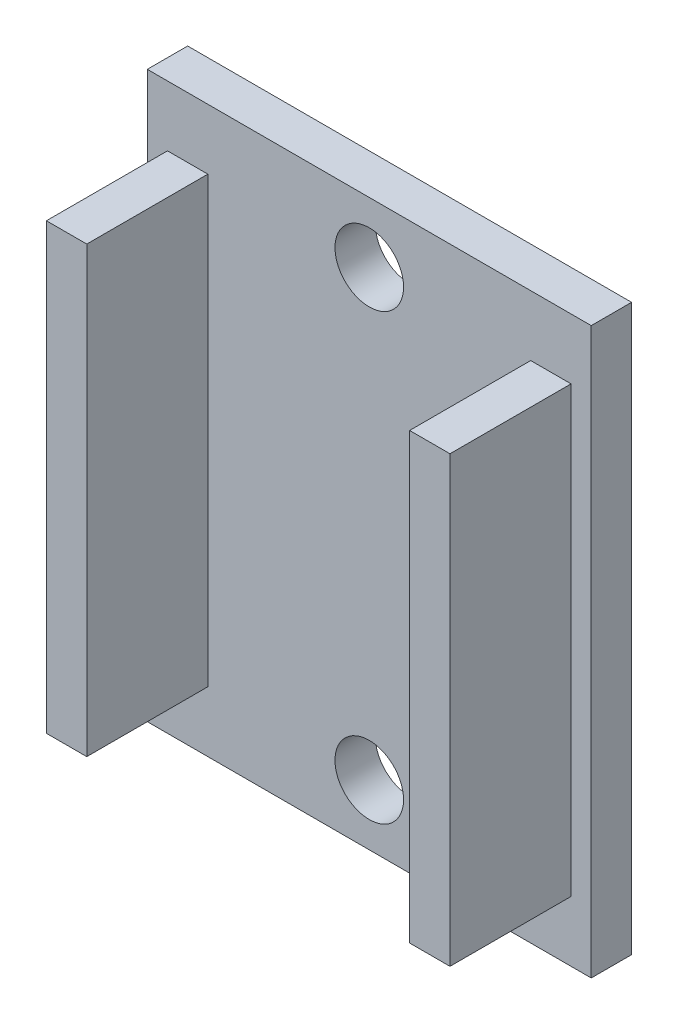
ISO-10303-21;
HEADER;
FILE_DESCRIPTION(('STEP AP214'),'2;1');
FILE_NAME('part.step','',(''),(''),'','','');
FILE_SCHEMA(('AUTOMOTIVE_DESIGN { 1 0 10303 214 1 1 1 1 }'));
ENDSEC;
DATA;
#1=APPLICATION_CONTEXT('core data for automotive mechanical design processes');
#2=APPLICATION_PROTOCOL_DEFINITION('international standard','automotive_design',2000,#1);
#3=PRODUCT_CONTEXT('',#1,'mechanical');
#4=PRODUCT('Part','Part','',(#3));
#5=PRODUCT_RELATED_PRODUCT_CATEGORY('part','',(#4));
#6=PRODUCT_DEFINITION_FORMATION('','',#4);
#7=PRODUCT_DEFINITION_CONTEXT('part definition',#1,'design');
#8=PRODUCT_DEFINITION('design','',#6,#7);
#9=PRODUCT_DEFINITION_SHAPE('','',#8);
#10=(LENGTH_UNIT() NAMED_UNIT(*) SI_UNIT(.MILLI.,.METRE.));
#11=(NAMED_UNIT(*) PLANE_ANGLE_UNIT() SI_UNIT($,.RADIAN.));
#12=(NAMED_UNIT(*) SI_UNIT($,.STERADIAN.) SOLID_ANGLE_UNIT());
#13=UNCERTAINTY_MEASURE_WITH_UNIT(LENGTH_MEASURE(1.E-05),#10,'distance_accuracy_value','');
#14=(GEOMETRIC_REPRESENTATION_CONTEXT(3) GLOBAL_UNCERTAINTY_ASSIGNED_CONTEXT((#13)) GLOBAL_UNIT_ASSIGNED_CONTEXT((#10,
#11,#12)) REPRESENTATION_CONTEXT('',''));
#15=CARTESIAN_POINT('',(0.,0.,0.));
#16=DIRECTION('',(0.,0.,1.));
#17=DIRECTION('',(1.,0.,0.));
#18=AXIS2_PLACEMENT_3D('',#15,#16,#17);
#19=CARTESIAN_POINT('',(0.,0.,90.));
#20=DIRECTION('',(0.,0.,1.));
#21=DIRECTION('',(1.,0.,0.));
#22=AXIS2_PLACEMENT_3D('',#19,#20,#21);
#23=PLANE('',#22);
#24=DIRECTION('',(0.,-1.,0.));
#25=VECTOR('',#24,1.);
#26=CARTESIAN_POINT('',(-195.,40.,90.));
#27=LINE('',#26,#25);
#28=CARTESIAN_POINT('',(-195.,40.,90.));
#29=VERTEX_POINT('',#28);
#30=CARTESIAN_POINT('',(-195.,18.,90.));
#31=VERTEX_POINT('',#30);
#32=EDGE_CURVE('E57',#29,#31,#27,.T.);
#33=ORIENTED_EDGE('',*,*,#32,.F.);
#34=DIRECTION('',(-1.,0.,0.));
#35=VECTOR('',#34,1.);
#36=CARTESIAN_POINT('',(-195.,40.,90.));
#37=LINE('',#36,#35);
#38=CARTESIAN_POINT('',(-193.,40.,90.));
#39=VERTEX_POINT('',#38);
#40=EDGE_CURVE('E58',#39,#29,#37,.T.);
#41=ORIENTED_EDGE('',*,*,#40,.F.);
#42=DIRECTION('',(0.,1.,0.));
#43=VECTOR('',#42,1.);
#44=CARTESIAN_POINT('',(-193.,40.,90.));
#45=LINE('',#44,#43);
#46=CARTESIAN_POINT('',(-193.,18.,90.));
#47=VERTEX_POINT('',#46);
#48=EDGE_CURVE('E417',#47,#39,#45,.T.);
#49=ORIENTED_EDGE('',*,*,#48,.F.);
#50=DIRECTION('',(1.,0.,0.));
#51=VECTOR('',#50,1.);
#52=CARTESIAN_POINT('',(-195.,18.,90.));
#53=LINE('',#52,#51);
#54=EDGE_CURVE('E421',#31,#47,#53,.T.);
#55=ORIENTED_EDGE('',*,*,#54,.F.);
#56=EDGE_LOOP('',(#33,#41,#49,#55));
#57=FACE_BOUND('',#56,.T.);
#58=DIRECTION('',(-1.,0.,0.));
#59=VECTOR('',#58,1.);
#60=CARTESIAN_POINT('',(-213.,40.,90.));
#61=LINE('',#60,#59);
#62=CARTESIAN_POINT('',(-211.,40.,90.));
#63=VERTEX_POINT('',#62);
#64=CARTESIAN_POINT('',(-213.,40.,90.));
#65=VERTEX_POINT('',#64);
#66=EDGE_CURVE('E185',#63,#65,#61,.T.);
#67=ORIENTED_EDGE('',*,*,#66,.F.);
#68=DIRECTION('',(0.,1.,0.));
#69=VECTOR('',#68,1.);
#70=CARTESIAN_POINT('',(-211.,40.,90.));
#71=LINE('',#70,#69);
#72=CARTESIAN_POINT('',(-211.,18.,90.));
#73=VERTEX_POINT('',#72);
#74=EDGE_CURVE('E171',#73,#63,#71,.T.);
#75=ORIENTED_EDGE('',*,*,#74,.F.);
#76=DIRECTION('',(1.,0.,0.));
#77=VECTOR('',#76,1.);
#78=CARTESIAN_POINT('',(-213.,18.,90.));
#79=LINE('',#78,#77);
#80=CARTESIAN_POINT('',(-213.,18.,90.));
#81=VERTEX_POINT('',#80);
#82=EDGE_CURVE('E172',#81,#73,#79,.T.);
#83=ORIENTED_EDGE('',*,*,#82,.F.);
#84=DIRECTION('',(0.,-1.,0.));
#85=VECTOR('',#84,1.);
#86=CARTESIAN_POINT('',(-213.,40.,90.));
#87=LINE('',#86,#85);
#88=EDGE_CURVE('E176',#65,#81,#87,.T.);
#89=ORIENTED_EDGE('',*,*,#88,.F.);
#90=EDGE_LOOP('',(#67,#75,#83,#89));
#91=FACE_BOUND('',#90,.T.);
#92=CARTESIAN_POINT('',(-203.,18.,90.));
#93=DIRECTION('',(0.,0.,1.));
#94=DIRECTION('',(1.,0.,0.));
#95=AXIS2_PLACEMENT_3D('',#92,#93,#94);
#96=CIRCLE('',#95,1.70000000000001);
#97=CARTESIAN_POINT('',(-201.3,18.,90.));
#98=VERTEX_POINT('',#97);
#99=EDGE_CURVE('E193',#98,#98,#96,.T.);
#100=ORIENTED_EDGE('',*,*,#99,.F.);
#101=EDGE_LOOP('',(#100));
#102=FACE_BOUND('',#101,.T.);
#103=DIRECTION('',(0.,-1.,0.));
#104=VECTOR('',#103,1.);
#105=CARTESIAN_POINT('',(-214.,43.,90.));
#106=LINE('',#105,#104);
#107=CARTESIAN_POINT('',(-214.,43.,90.));
#108=VERTEX_POINT('',#107);
#109=CARTESIAN_POINT('',(-214.,15.,90.));
#110=VERTEX_POINT('',#109);
#111=EDGE_CURVE('E203',#108,#110,#106,.T.);
#112=ORIENTED_EDGE('',*,*,#111,.T.);
#113=DIRECTION('',(1.,0.,0.));
#114=VECTOR('',#113,1.);
#115=CARTESIAN_POINT('',(-214.,15.,90.));
#116=LINE('',#115,#114);
#117=CARTESIAN_POINT('',(-192.,15.,90.));
#118=VERTEX_POINT('',#117);
#119=EDGE_CURVE('E204',#110,#118,#116,.T.);
#120=ORIENTED_EDGE('',*,*,#119,.T.);
#121=DIRECTION('',(0.,1.,0.));
#122=VECTOR('',#121,1.);
#123=CARTESIAN_POINT('',(-192.,43.,90.));
#124=LINE('',#123,#122);
#125=CARTESIAN_POINT('',(-192.,43.,90.));
#126=VERTEX_POINT('',#125);
#127=EDGE_CURVE('E210',#118,#126,#124,.T.);
#128=ORIENTED_EDGE('',*,*,#127,.T.);
#129=DIRECTION('',(-1.,0.,0.));
#130=VECTOR('',#129,1.);
#131=CARTESIAN_POINT('',(-214.,43.,90.));
#132=LINE('',#131,#130);
#133=EDGE_CURVE('E207',#126,#108,#132,.T.);
#134=ORIENTED_EDGE('',*,*,#133,.T.);
#135=EDGE_LOOP('',(#112,#120,#128,#134));
#136=FACE_BOUND('',#135,.T.);
#137=CARTESIAN_POINT('',(-203.,40.,90.));
#138=DIRECTION('',(0.,0.,1.));
#139=DIRECTION('',(1.,0.,0.));
#140=AXIS2_PLACEMENT_3D('',#137,#138,#139);
#141=CIRCLE('',#140,1.70000000000001);
#142=CARTESIAN_POINT('',(-201.3,40.,90.));
#143=VERTEX_POINT('',#142);
#144=EDGE_CURVE('E153',#143,#143,#141,.T.);
#145=ORIENTED_EDGE('',*,*,#144,.F.);
#146=EDGE_LOOP('',(#145));
#147=FACE_BOUND('',#146,.T.);
#148=ADVANCED_FACE('F41',(#57,#91,#102,#136,#147),#23,.T.);
#149=CARTESIAN_POINT('',(0.,0.,88.));
#150=DIRECTION('',(0.,0.,1.));
#151=DIRECTION('',(1.,0.,0.));
#152=AXIS2_PLACEMENT_3D('',#149,#150,#151);
#153=PLANE('',#152);
#154=DIRECTION('',(0.,-1.,0.));
#155=VECTOR('',#154,1.);
#156=CARTESIAN_POINT('',(-214.,43.,88.));
#157=LINE('',#156,#155);
#158=CARTESIAN_POINT('',(-214.,43.,88.));
#159=VERTEX_POINT('',#158);
#160=CARTESIAN_POINT('',(-214.,15.,88.));
#161=VERTEX_POINT('',#160);
#162=EDGE_CURVE('E196',#159,#161,#157,.T.);
#163=ORIENTED_EDGE('',*,*,#162,.F.);
#164=DIRECTION('',(-1.,0.,0.));
#165=VECTOR('',#164,1.);
#166=CARTESIAN_POINT('',(-214.,43.,88.));
#167=LINE('',#166,#165);
#168=CARTESIAN_POINT('',(-192.,43.,88.));
#169=VERTEX_POINT('',#168);
#170=EDGE_CURVE('E202',#169,#159,#167,.T.);
#171=ORIENTED_EDGE('',*,*,#170,.F.);
#172=DIRECTION('',(0.,1.,0.));
#173=VECTOR('',#172,1.);
#174=CARTESIAN_POINT('',(-192.,43.,88.));
#175=LINE('',#174,#173);
#176=CARTESIAN_POINT('',(-192.,15.,88.));
#177=VERTEX_POINT('',#176);
#178=EDGE_CURVE('E216',#177,#169,#175,.T.);
#179=ORIENTED_EDGE('',*,*,#178,.F.);
#180=DIRECTION('',(1.,0.,0.));
#181=VECTOR('',#180,1.);
#182=CARTESIAN_POINT('',(-214.,15.,88.));
#183=LINE('',#182,#181);
#184=EDGE_CURVE('E212',#161,#177,#183,.T.);
#185=ORIENTED_EDGE('',*,*,#184,.F.);
#186=EDGE_LOOP('',(#163,#171,#179,#185));
#187=FACE_BOUND('',#186,.T.);
#188=CARTESIAN_POINT('',(-203.,18.,88.));
#189=DIRECTION('',(0.,0.,1.));
#190=DIRECTION('',(1.,0.,0.));
#191=AXIS2_PLACEMENT_3D('',#188,#189,#190);
#192=CIRCLE('',#191,1.70000000000001);
#193=CARTESIAN_POINT('',(-201.3,18.,88.));
#194=VERTEX_POINT('',#193);
#195=EDGE_CURVE('E195',#194,#194,#192,.T.);
#196=ORIENTED_EDGE('',*,*,#195,.T.);
#197=EDGE_LOOP('',(#196));
#198=FACE_BOUND('',#197,.T.);
#199=CARTESIAN_POINT('',(-203.,40.,88.));
#200=DIRECTION('',(0.,0.,1.));
#201=DIRECTION('',(1.,0.,0.));
#202=AXIS2_PLACEMENT_3D('',#199,#200,#201);
#203=CIRCLE('',#202,1.70000000000001);
#204=CARTESIAN_POINT('',(-201.3,40.,88.));
#205=VERTEX_POINT('',#204);
#206=EDGE_CURVE('E147',#205,#205,#203,.T.);
#207=ORIENTED_EDGE('',*,*,#206,.T.);
#208=EDGE_LOOP('',(#207));
#209=FACE_BOUND('',#208,.T.);
#210=ADVANCED_FACE('F231',(#187,#198,#209),#153,.F.);
#211=CARTESIAN_POINT('',(-214.,43.,90.));
#212=DIRECTION('',(1.,0.,0.));
#213=DIRECTION('',(0.,0.,-1.));
#214=AXIS2_PLACEMENT_3D('',#211,#212,#213);
#215=PLANE('',#214);
#216=ORIENTED_EDGE('',*,*,#162,.T.);
#217=DIRECTION('',(0.,0.,-1.));
#218=VECTOR('',#217,1.);
#219=CARTESIAN_POINT('',(-214.,15.,90.));
#220=LINE('',#219,#218);
#221=EDGE_CURVE('E11',#110,#161,#220,.T.);
#222=ORIENTED_EDGE('',*,*,#221,.F.);
#223=ORIENTED_EDGE('',*,*,#111,.F.);
#224=DIRECTION('',(0.,0.,-1.));
#225=VECTOR('',#224,1.);
#226=CARTESIAN_POINT('',(-214.,43.,90.));
#227=LINE('',#226,#225);
#228=EDGE_CURVE('E211',#108,#159,#227,.T.);
#229=ORIENTED_EDGE('',*,*,#228,.T.);
#230=EDGE_LOOP('',(#216,#222,#223,#229));
#231=FACE_BOUND('',#230,.T.);
#232=ADVANCED_FACE('F43',(#231),#215,.F.);
#233=CARTESIAN_POINT('',(-214.,15.,90.));
#234=DIRECTION('',(0.,1.,0.));
#235=DIRECTION('',(0.,0.,1.));
#236=AXIS2_PLACEMENT_3D('',#233,#234,#235);
#237=PLANE('',#236);
#238=ORIENTED_EDGE('',*,*,#184,.T.);
#239=DIRECTION('',(0.,0.,-1.));
#240=VECTOR('',#239,1.);
#241=CARTESIAN_POINT('',(-192.,15.,90.));
#242=LINE('',#241,#240);
#243=EDGE_CURVE('E47',#118,#177,#242,.T.);
#244=ORIENTED_EDGE('',*,*,#243,.F.);
#245=ORIENTED_EDGE('',*,*,#119,.F.);
#246=ORIENTED_EDGE('',*,*,#221,.T.);
#247=EDGE_LOOP('',(#238,#244,#245,#246));
#248=FACE_BOUND('',#247,.T.);
#249=ADVANCED_FACE('F242',(#248),#237,.F.);
#250=CARTESIAN_POINT('',(-192.,43.,90.));
#251=DIRECTION('',(-1.,0.,0.));
#252=DIRECTION('',(0.,0.,1.));
#253=AXIS2_PLACEMENT_3D('',#250,#251,#252);
#254=PLANE('',#253);
#255=ORIENTED_EDGE('',*,*,#178,.T.);
#256=DIRECTION('',(0.,0.,-1.));
#257=VECTOR('',#256,1.);
#258=CARTESIAN_POINT('',(-192.,43.,90.));
#259=LINE('',#258,#257);
#260=EDGE_CURVE('E222',#126,#169,#259,.T.);
#261=ORIENTED_EDGE('',*,*,#260,.F.);
#262=ORIENTED_EDGE('',*,*,#127,.F.);
#263=ORIENTED_EDGE('',*,*,#243,.T.);
#264=EDGE_LOOP('',(#255,#261,#262,#263));
#265=FACE_BOUND('',#264,.T.);
#266=ADVANCED_FACE('F230',(#265),#254,.F.);
#267=CARTESIAN_POINT('',(-214.,43.,90.));
#268=DIRECTION('',(0.,-1.,0.));
#269=DIRECTION('',(0.,0.,-1.));
#270=AXIS2_PLACEMENT_3D('',#267,#268,#269);
#271=PLANE('',#270);
#272=ORIENTED_EDGE('',*,*,#170,.T.);
#273=ORIENTED_EDGE('',*,*,#228,.F.);
#274=ORIENTED_EDGE('',*,*,#133,.F.);
#275=ORIENTED_EDGE('',*,*,#260,.T.);
#276=EDGE_LOOP('',(#272,#273,#274,#275));
#277=FACE_BOUND('',#276,.T.);
#278=ADVANCED_FACE('F236',(#277),#271,.F.);
#279=CARTESIAN_POINT('',(-203.,18.,90.));
#280=DIRECTION('',(0.,0.,-1.));
#281=DIRECTION('',(-1.,0.,0.));
#282=AXIS2_PLACEMENT_3D('',#279,#280,#281);
#283=CYLINDRICAL_SURFACE('',#282,1.70000000000001);
#284=ORIENTED_EDGE('',*,*,#99,.T.);
#285=EDGE_LOOP('',(#284));
#286=FACE_BOUND('',#285,.T.);
#287=ORIENTED_EDGE('',*,*,#195,.F.);
#288=EDGE_LOOP('',(#287));
#289=FACE_BOUND('',#288,.T.);
#290=ADVANCED_FACE('F265',(#286,#289),#283,.F.);
#291=CARTESIAN_POINT('',(-203.,40.,90.));
#292=DIRECTION('',(0.,0.,-1.));
#293=DIRECTION('',(-1.,0.,0.));
#294=AXIS2_PLACEMENT_3D('',#291,#292,#293);
#295=CYLINDRICAL_SURFACE('',#294,1.70000000000001);
#296=ORIENTED_EDGE('',*,*,#144,.T.);
#297=EDGE_LOOP('',(#296));
#298=FACE_BOUND('',#297,.T.);
#299=ORIENTED_EDGE('',*,*,#206,.F.);
#300=EDGE_LOOP('',(#299));
#301=FACE_BOUND('',#300,.T.);
#302=ADVANCED_FACE('F267',(#298,#301),#295,.F.);
#303=CARTESIAN_POINT('',(-213.,40.,96.));
#304=DIRECTION('',(0.,-1.,0.));
#305=DIRECTION('',(0.,0.,-1.));
#306=AXIS2_PLACEMENT_3D('',#303,#304,#305);
#307=PLANE('',#306);
#308=ORIENTED_EDGE('',*,*,#66,.T.);
#309=DIRECTION('',(0.,0.,-1.));
#310=VECTOR('',#309,1.);
#311=CARTESIAN_POINT('',(-213.,40.,96.));
#312=LINE('',#311,#310);
#313=CARTESIAN_POINT('',(-213.,40.,96.));
#314=VERTEX_POINT('',#313);
#315=EDGE_CURVE('E157',#314,#65,#312,.T.);
#316=ORIENTED_EDGE('',*,*,#315,.F.);
#317=DIRECTION('',(-1.,0.,0.));
#318=VECTOR('',#317,1.);
#319=CARTESIAN_POINT('',(-213.,40.,96.));
#320=LINE('',#319,#318);
#321=CARTESIAN_POINT('',(-211.,40.,96.));
#322=VERTEX_POINT('',#321);
#323=EDGE_CURVE('E177',#322,#314,#320,.T.);
#324=ORIENTED_EDGE('',*,*,#323,.F.);
#325=DIRECTION('',(0.,0.,-1.));
#326=VECTOR('',#325,1.);
#327=CARTESIAN_POINT('',(-211.,40.,96.));
#328=LINE('',#327,#326);
#329=EDGE_CURVE('E169',#322,#63,#328,.T.);
#330=ORIENTED_EDGE('',*,*,#329,.T.);
#331=EDGE_LOOP('',(#308,#316,#324,#330));
#332=FACE_BOUND('',#331,.T.);
#333=ADVANCED_FACE('F272',(#332),#307,.F.);
#334=CARTESIAN_POINT('',(-213.,40.,96.));
#335=DIRECTION('',(1.,0.,0.));
#336=DIRECTION('',(0.,0.,-1.));
#337=AXIS2_PLACEMENT_3D('',#334,#335,#336);
#338=PLANE('',#337);
#339=ORIENTED_EDGE('',*,*,#88,.T.);
#340=DIRECTION('',(0.,0.,-1.));
#341=VECTOR('',#340,1.);
#342=CARTESIAN_POINT('',(-213.,18.,96.));
#343=LINE('',#342,#341);
#344=CARTESIAN_POINT('',(-213.,18.,96.));
#345=VERTEX_POINT('',#344);
#346=EDGE_CURVE('E165',#345,#81,#343,.T.);
#347=ORIENTED_EDGE('',*,*,#346,.F.);
#348=DIRECTION('',(0.,-1.,0.));
#349=VECTOR('',#348,1.);
#350=CARTESIAN_POINT('',(-213.,40.,96.));
#351=LINE('',#350,#349);
#352=EDGE_CURVE('E190',#314,#345,#351,.T.);
#353=ORIENTED_EDGE('',*,*,#352,.F.);
#354=ORIENTED_EDGE('',*,*,#315,.T.);
#355=EDGE_LOOP('',(#339,#347,#353,#354));
#356=FACE_BOUND('',#355,.T.);
#357=ADVANCED_FACE('F283',(#356),#338,.F.);
#358=CARTESIAN_POINT('',(-213.,18.,96.));
#359=DIRECTION('',(0.,1.,0.));
#360=DIRECTION('',(0.,0.,1.));
#361=AXIS2_PLACEMENT_3D('',#358,#359,#360);
#362=PLANE('',#361);
#363=ORIENTED_EDGE('',*,*,#82,.T.);
#364=DIRECTION('',(0.,0.,-1.));
#365=VECTOR('',#364,1.);
#366=CARTESIAN_POINT('',(-211.,18.,96.));
#367=LINE('',#366,#365);
#368=CARTESIAN_POINT('',(-211.,18.,96.));
#369=VERTEX_POINT('',#368);
#370=EDGE_CURVE('E164',#369,#73,#367,.T.);
#371=ORIENTED_EDGE('',*,*,#370,.F.);
#372=DIRECTION('',(1.,0.,0.));
#373=VECTOR('',#372,1.);
#374=CARTESIAN_POINT('',(-213.,18.,96.));
#375=LINE('',#374,#373);
#376=EDGE_CURVE('E189',#345,#369,#375,.T.);
#377=ORIENTED_EDGE('',*,*,#376,.F.);
#378=ORIENTED_EDGE('',*,*,#346,.T.);
#379=EDGE_LOOP('',(#363,#371,#377,#378));
#380=FACE_BOUND('',#379,.T.);
#381=ADVANCED_FACE('F293',(#380),#362,.F.);
#382=CARTESIAN_POINT('',(-211.,40.,96.));
#383=DIRECTION('',(-1.,0.,0.));
#384=DIRECTION('',(0.,0.,1.));
#385=AXIS2_PLACEMENT_3D('',#382,#383,#384);
#386=PLANE('',#385);
#387=ORIENTED_EDGE('',*,*,#74,.T.);
#388=ORIENTED_EDGE('',*,*,#329,.F.);
#389=DIRECTION('',(0.,1.,0.));
#390=VECTOR('',#389,1.);
#391=CARTESIAN_POINT('',(-211.,40.,96.));
#392=LINE('',#391,#390);
#393=EDGE_CURVE('E174',#369,#322,#392,.T.);
#394=ORIENTED_EDGE('',*,*,#393,.F.);
#395=ORIENTED_EDGE('',*,*,#370,.T.);
#396=EDGE_LOOP('',(#387,#388,#394,#395));
#397=FACE_BOUND('',#396,.T.);
#398=ADVANCED_FACE('F292',(#397),#386,.F.);
#399=CARTESIAN_POINT('',(0.,0.,96.));
#400=DIRECTION('',(0.,0.,-1.));
#401=DIRECTION('',(-1.,0.,0.));
#402=AXIS2_PLACEMENT_3D('',#399,#400,#401);
#403=PLANE('',#402);
#404=ORIENTED_EDGE('',*,*,#323,.T.);
#405=ORIENTED_EDGE('',*,*,#352,.T.);
#406=ORIENTED_EDGE('',*,*,#376,.T.);
#407=ORIENTED_EDGE('',*,*,#393,.T.);
#408=EDGE_LOOP('',(#404,#405,#406,#407));
#409=FACE_BOUND('',#408,.T.);
#410=ADVANCED_FACE('F290',(#409),#403,.F.);
#411=CARTESIAN_POINT('',(-195.,40.,96.));
#412=DIRECTION('',(1.,0.,0.));
#413=DIRECTION('',(0.,0.,-1.));
#414=AXIS2_PLACEMENT_3D('',#411,#412,#413);
#415=PLANE('',#414);
#416=ORIENTED_EDGE('',*,*,#32,.T.);
#417=DIRECTION('',(0.,0.,-1.));
#418=VECTOR('',#417,1.);
#419=CARTESIAN_POINT('',(-195.,18.,96.));
#420=LINE('',#419,#418);
#421=CARTESIAN_POINT('',(-195.,18.,96.));
#422=VERTEX_POINT('',#421);
#423=EDGE_CURVE('E135',#422,#31,#420,.T.);
#424=ORIENTED_EDGE('',*,*,#423,.F.);
#425=DIRECTION('',(0.,-1.,0.));
#426=VECTOR('',#425,1.);
#427=CARTESIAN_POINT('',(-195.,40.,96.));
#428=LINE('',#427,#426);
#429=CARTESIAN_POINT('',(-195.,40.,96.));
#430=VERTEX_POINT('',#429);
#431=EDGE_CURVE('E136',#430,#422,#428,.T.);
#432=ORIENTED_EDGE('',*,*,#431,.F.);
#433=DIRECTION('',(0.,0.,-1.));
#434=VECTOR('',#433,1.);
#435=CARTESIAN_POINT('',(-195.,40.,96.));
#436=LINE('',#435,#434);
#437=EDGE_CURVE('E413',#430,#29,#436,.T.);
#438=ORIENTED_EDGE('',*,*,#437,.T.);
#439=EDGE_LOOP('',(#416,#424,#432,#438));
#440=FACE_BOUND('',#439,.T.);
#441=ADVANCED_FACE('F149',(#440),#415,.F.);
#442=CARTESIAN_POINT('',(-195.,18.,96.));
#443=DIRECTION('',(0.,1.,0.));
#444=DIRECTION('',(0.,0.,1.));
#445=AXIS2_PLACEMENT_3D('',#442,#443,#444);
#446=PLANE('',#445);
#447=ORIENTED_EDGE('',*,*,#54,.T.);
#448=DIRECTION('',(0.,0.,-1.));
#449=VECTOR('',#448,1.);
#450=CARTESIAN_POINT('',(-193.,18.,96.));
#451=LINE('',#450,#449);
#452=CARTESIAN_POINT('',(-193.,18.,96.));
#453=VERTEX_POINT('',#452);
#454=EDGE_CURVE('E132',#453,#47,#451,.T.);
#455=ORIENTED_EDGE('',*,*,#454,.F.);
#456=DIRECTION('',(1.,0.,0.));
#457=VECTOR('',#456,1.);
#458=CARTESIAN_POINT('',(-195.,18.,96.));
#459=LINE('',#458,#457);
#460=EDGE_CURVE('E126',#422,#453,#459,.T.);
#461=ORIENTED_EDGE('',*,*,#460,.F.);
#462=ORIENTED_EDGE('',*,*,#423,.T.);
#463=EDGE_LOOP('',(#447,#455,#461,#462));
#464=FACE_BOUND('',#463,.T.);
#465=ADVANCED_FACE('F134',(#464),#446,.F.);
#466=CARTESIAN_POINT('',(-193.,40.,96.));
#467=DIRECTION('',(-1.,0.,0.));
#468=DIRECTION('',(0.,0.,1.));
#469=AXIS2_PLACEMENT_3D('',#466,#467,#468);
#470=PLANE('',#469);
#471=ORIENTED_EDGE('',*,*,#48,.T.);
#472=DIRECTION('',(0.,0.,-1.));
#473=VECTOR('',#472,1.);
#474=CARTESIAN_POINT('',(-193.,40.,96.));
#475=LINE('',#474,#473);
#476=CARTESIAN_POINT('',(-193.,40.,96.));
#477=VERTEX_POINT('',#476);
#478=EDGE_CURVE('E154',#477,#39,#475,.T.);
#479=ORIENTED_EDGE('',*,*,#478,.F.);
#480=DIRECTION('',(0.,1.,0.));
#481=VECTOR('',#480,1.);
#482=CARTESIAN_POINT('',(-193.,40.,96.));
#483=LINE('',#482,#481);
#484=EDGE_CURVE('E140',#453,#477,#483,.T.);
#485=ORIENTED_EDGE('',*,*,#484,.F.);
#486=ORIENTED_EDGE('',*,*,#454,.T.);
#487=EDGE_LOOP('',(#471,#479,#485,#486));
#488=FACE_BOUND('',#487,.T.);
#489=ADVANCED_FACE('F307',(#488),#470,.F.);
#490=CARTESIAN_POINT('',(-195.,40.,96.));
#491=DIRECTION('',(0.,-1.,0.));
#492=DIRECTION('',(0.,0.,-1.));
#493=AXIS2_PLACEMENT_3D('',#490,#491,#492);
#494=PLANE('',#493);
#495=ORIENTED_EDGE('',*,*,#40,.T.);
#496=ORIENTED_EDGE('',*,*,#437,.F.);
#497=DIRECTION('',(-1.,0.,0.));
#498=VECTOR('',#497,1.);
#499=CARTESIAN_POINT('',(-195.,40.,96.));
#500=LINE('',#499,#498);
#501=EDGE_CURVE('E145',#477,#430,#500,.T.);
#502=ORIENTED_EDGE('',*,*,#501,.F.);
#503=ORIENTED_EDGE('',*,*,#478,.T.);
#504=EDGE_LOOP('',(#495,#496,#502,#503));
#505=FACE_BOUND('',#504,.T.);
#506=ADVANCED_FACE('F309',(#505),#494,.F.);
#507=CARTESIAN_POINT('',(0.,0.,96.));
#508=DIRECTION('',(0.,0.,1.));
#509=DIRECTION('',(1.,0.,0.));
#510=AXIS2_PLACEMENT_3D('',#507,#508,#509);
#511=PLANE('',#510);
#512=ORIENTED_EDGE('',*,*,#431,.T.);
#513=ORIENTED_EDGE('',*,*,#460,.T.);
#514=ORIENTED_EDGE('',*,*,#484,.T.);
#515=ORIENTED_EDGE('',*,*,#501,.T.);
#516=EDGE_LOOP('',(#512,#513,#514,#515));
#517=FACE_BOUND('',#516,.T.);
#518=ADVANCED_FACE('F142',(#517),#511,.T.);
#519=CLOSED_SHELL('',(#148,#210,#232,#249,#266,#278,#290,#302,#333,#357,#381,#398,#410,#441,
#465,#489,#506,#518));
#520=MANIFOLD_SOLID_BREP('B2',#519);
#521=ADVANCED_BREP_SHAPE_REPRESENTATION('',(#18,#520),#14);
#522=SHAPE_DEFINITION_REPRESENTATION(#9,#521);
ENDSEC;
END-ISO-10303-21;
